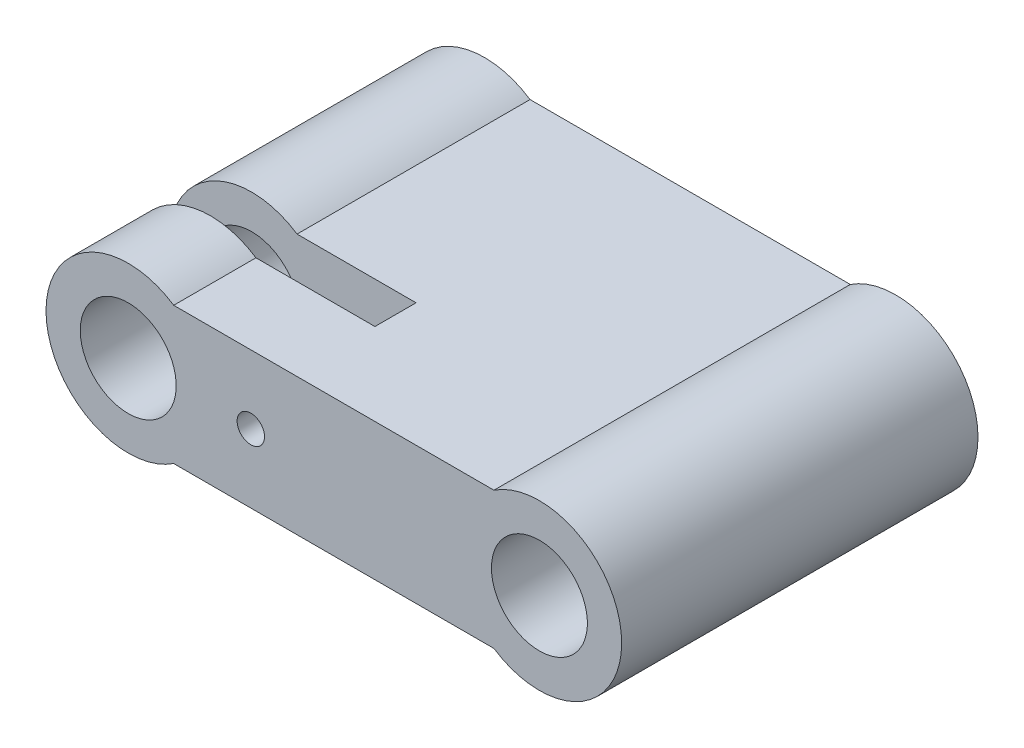
ISO-10303-21;
HEADER;
FILE_DESCRIPTION(('STEP AP214'),'2;1');
FILE_NAME('part.step','',(''),(''),'','','');
FILE_SCHEMA(('AUTOMOTIVE_DESIGN { 1 0 10303 214 1 1 1 1 }'));
ENDSEC;
DATA;
#1=APPLICATION_CONTEXT('core data for automotive mechanical design processes');
#2=APPLICATION_PROTOCOL_DEFINITION('international standard','automotive_design',2000,#1);
#3=PRODUCT_CONTEXT('',#1,'mechanical');
#4=PRODUCT('Part','Part','',(#3));
#5=PRODUCT_RELATED_PRODUCT_CATEGORY('part','',(#4));
#6=PRODUCT_DEFINITION_FORMATION('','',#4);
#7=PRODUCT_DEFINITION_CONTEXT('part definition',#1,'design');
#8=PRODUCT_DEFINITION('design','',#6,#7);
#9=PRODUCT_DEFINITION_SHAPE('','',#8);
#10=(LENGTH_UNIT() NAMED_UNIT(*) SI_UNIT(.MILLI.,.METRE.));
#11=(NAMED_UNIT(*) PLANE_ANGLE_UNIT() SI_UNIT($,.RADIAN.));
#12=(NAMED_UNIT(*) SI_UNIT($,.STERADIAN.) SOLID_ANGLE_UNIT());
#13=UNCERTAINTY_MEASURE_WITH_UNIT(LENGTH_MEASURE(1.E-05),#10,'distance_accuracy_value','');
#14=(GEOMETRIC_REPRESENTATION_CONTEXT(3) GLOBAL_UNCERTAINTY_ASSIGNED_CONTEXT((#13)) GLOBAL_UNIT_ASSIGNED_CONTEXT((#10,
#11,#12)) REPRESENTATION_CONTEXT('',''));
#15=CARTESIAN_POINT('',(0.,0.,0.));
#16=DIRECTION('',(0.,0.,1.));
#17=DIRECTION('',(1.,0.,0.));
#18=AXIS2_PLACEMENT_3D('',#15,#16,#17);
#19=CARTESIAN_POINT('',(0.,-37.,141.361318671366));
#20=DIRECTION('',(0.,1.,0.));
#21=DIRECTION('',(0.,0.,1.));
#22=AXIS2_PLACEMENT_3D('',#19,#20,#21);
#23=PLANE('',#22);
#24=DIRECTION('',(-1.,0.,0.));
#25=VECTOR('',#24,1.);
#26=CARTESIAN_POINT('',(0.,-37.,41.));
#27=LINE('',#26,#25);
#28=CARTESIAN_POINT('',(-47.5,-37.,41.));
#29=VERTEX_POINT('',#28);
#30=CARTESIAN_POINT('',(-64.8667504192892,-37.,41.));
#31=VERTEX_POINT('',#30);
#32=EDGE_CURVE('E150',#29,#31,#27,.T.);
#33=ORIENTED_EDGE('',*,*,#32,.F.);
#34=DIRECTION('',(0.,0.,1.));
#35=VECTOR('',#34,1.);
#36=CARTESIAN_POINT('',(-47.5,-37.,-38.5391052434009));
#37=LINE('',#36,#35);
#38=CARTESIAN_POINT('',(-47.5,-37.,35.));
#39=VERTEX_POINT('',#38);
#40=EDGE_CURVE('E128',#39,#29,#37,.T.);
#41=ORIENTED_EDGE('',*,*,#40,.F.);
#42=DIRECTION('',(-1.,0.,0.));
#43=VECTOR('',#42,1.);
#44=CARTESIAN_POINT('',(0.,-37.,35.));
#45=LINE('',#44,#43);
#46=CARTESIAN_POINT('',(-64.8667504192892,-37.,35.));
#47=VERTEX_POINT('',#46);
#48=EDGE_CURVE('E181',#39,#47,#45,.T.);
#49=ORIENTED_EDGE('',*,*,#48,.T.);
#50=DIRECTION('',(0.,0.,-1.));
#51=VECTOR('',#50,1.);
#52=CARTESIAN_POINT('',(-64.8667504192892,-37.,141.361318671366));
#53=LINE('',#52,#51);
#54=CARTESIAN_POINT('',(-64.8667504192892,-37.,1.));
#55=VERTEX_POINT('',#54);
#56=EDGE_CURVE('E107',#47,#55,#53,.T.);
#57=ORIENTED_EDGE('',*,*,#56,.T.);
#58=DIRECTION('',(1.,0.,0.));
#59=VECTOR('',#58,1.);
#60=CARTESIAN_POINT('',(0.,-37.,1.));
#61=LINE('',#60,#59);
#62=CARTESIAN_POINT('',(-18.1332495807108,-37.,1.));
#63=VERTEX_POINT('',#62);
#64=EDGE_CURVE('E99',#55,#63,#61,.T.);
#65=ORIENTED_EDGE('',*,*,#64,.T.);
#66=DIRECTION('',(0.,0.,-1.));
#67=VECTOR('',#66,1.);
#68=CARTESIAN_POINT('',(-18.1332495807108,-37.,141.361318671366));
#69=LINE('',#68,#67);
#70=CARTESIAN_POINT('',(-18.1332495807108,-37.,52.9999999999999));
#71=VERTEX_POINT('',#70);
#72=EDGE_CURVE('E84',#71,#63,#69,.T.);
#73=ORIENTED_EDGE('',*,*,#72,.F.);
#74=DIRECTION('',(-1.,0.,0.));
#75=VECTOR('',#74,1.);
#76=CARTESIAN_POINT('',(0.,-37.,52.9999999999999));
#77=LINE('',#76,#75);
#78=CARTESIAN_POINT('',(-64.8667504192892,-37.,52.9999999999999));
#79=VERTEX_POINT('',#78);
#80=EDGE_CURVE('E61',#71,#79,#77,.T.);
#81=ORIENTED_EDGE('',*,*,#80,.T.);
#82=EDGE_CURVE('E109',#79,#31,#53,.T.);
#83=ORIENTED_EDGE('',*,*,#82,.T.);
#84=EDGE_LOOP('',(#33,#41,#49,#57,#65,#73,#81,#83));
#85=FACE_BOUND('',#84,.T.);
#86=ADVANCED_FACE('F36',(#85),#23,.F.);
#87=CARTESIAN_POINT('',(0.,-17.,141.361318671366));
#88=DIRECTION('',(0.,1.,0.));
#89=DIRECTION('',(0.,0.,1.));
#90=AXIS2_PLACEMENT_3D('',#87,#88,#89);
#91=PLANE('',#90);
#92=DIRECTION('',(0.,0.,1.));
#93=VECTOR('',#92,1.);
#94=CARTESIAN_POINT('',(-47.5,-17.,-38.5391052434009));
#95=LINE('',#94,#93);
#96=CARTESIAN_POINT('',(-47.5,-17.,35.));
#97=VERTEX_POINT('',#96);
#98=CARTESIAN_POINT('',(-47.5,-17.,41.));
#99=VERTEX_POINT('',#98);
#100=EDGE_CURVE('E12',#97,#99,#95,.T.);
#101=ORIENTED_EDGE('',*,*,#100,.T.);
#102=DIRECTION('',(-1.,0.,0.));
#103=VECTOR('',#102,1.);
#104=CARTESIAN_POINT('',(0.,-17.,41.));
#105=LINE('',#104,#103);
#106=CARTESIAN_POINT('',(-64.8667504192892,-17.,41.));
#107=VERTEX_POINT('',#106);
#108=EDGE_CURVE('E147',#99,#107,#105,.T.);
#109=ORIENTED_EDGE('',*,*,#108,.T.);
#110=DIRECTION('',(0.,0.,-1.));
#111=VECTOR('',#110,1.);
#112=CARTESIAN_POINT('',(-64.8667504192892,-17.,141.361318671366));
#113=LINE('',#112,#111);
#114=CARTESIAN_POINT('',(-64.8667504192892,-17.,52.9999999999999));
#115=VERTEX_POINT('',#114);
#116=EDGE_CURVE('E118',#115,#107,#113,.T.);
#117=ORIENTED_EDGE('',*,*,#116,.F.);
#118=DIRECTION('',(-1.,0.,0.));
#119=VECTOR('',#118,1.);
#120=CARTESIAN_POINT('',(0.,-17.,52.9999999999999));
#121=LINE('',#120,#119);
#122=CARTESIAN_POINT('',(-18.1332495807108,-17.,52.9999999999999));
#123=VERTEX_POINT('',#122);
#124=EDGE_CURVE('E130',#123,#115,#121,.T.);
#125=ORIENTED_EDGE('',*,*,#124,.F.);
#126=DIRECTION('',(0.,0.,-1.));
#127=VECTOR('',#126,1.);
#128=CARTESIAN_POINT('',(-18.1332495807108,-17.,141.361318671366));
#129=LINE('',#128,#127);
#130=CARTESIAN_POINT('',(-18.1332495807108,-17.,1.));
#131=VERTEX_POINT('',#130);
#132=EDGE_CURVE('E102',#123,#131,#129,.T.);
#133=ORIENTED_EDGE('',*,*,#132,.T.);
#134=DIRECTION('',(1.,0.,0.));
#135=VECTOR('',#134,1.);
#136=CARTESIAN_POINT('',(0.,-17.,1.));
#137=LINE('',#136,#135);
#138=CARTESIAN_POINT('',(-64.8667504192892,-17.,1.));
#139=VERTEX_POINT('',#138);
#140=EDGE_CURVE('E101',#139,#131,#137,.T.);
#141=ORIENTED_EDGE('',*,*,#140,.F.);
#142=CARTESIAN_POINT('',(-64.8667504192892,-17.,35.));
#143=VERTEX_POINT('',#142);
#144=EDGE_CURVE('E121',#143,#139,#113,.T.);
#145=ORIENTED_EDGE('',*,*,#144,.F.);
#146=DIRECTION('',(-1.,0.,0.));
#147=VECTOR('',#146,1.);
#148=CARTESIAN_POINT('',(0.,-17.,35.));
#149=LINE('',#148,#147);
#150=EDGE_CURVE('E52',#97,#143,#149,.T.);
#151=ORIENTED_EDGE('',*,*,#150,.F.);
#152=EDGE_LOOP('',(#101,#109,#117,#125,#133,#141,#145,#151));
#153=FACE_BOUND('',#152,.T.);
#154=ADVANCED_FACE('F156',(#153),#91,.T.);
#155=CARTESIAN_POINT('',(-71.5,-27.,141.361318671366));
#156=DIRECTION('',(0.,0.,-1.));
#157=DIRECTION('',(-1.,0.,0.));
#158=AXIS2_PLACEMENT_3D('',#155,#156,#157);
#159=CYLINDRICAL_SURFACE('',#158,7.);
#160=CARTESIAN_POINT('',(-71.5,-27.,52.9999999999999));
#161=DIRECTION('',(0.,0.,-1.));
#162=DIRECTION('',(-1.,0.,0.));
#163=AXIS2_PLACEMENT_3D('',#160,#161,#162);
#164=CIRCLE('',#163,7.);
#165=CARTESIAN_POINT('',(-78.5,-27.,52.9999999999999));
#166=VERTEX_POINT('',#165);
#167=EDGE_CURVE('E123',#166,#166,#164,.T.);
#168=ORIENTED_EDGE('',*,*,#167,.F.);
#169=EDGE_LOOP('',(#168));
#170=FACE_BOUND('',#169,.T.);
#171=CARTESIAN_POINT('',(-71.5,-27.,41.));
#172=DIRECTION('',(0.,0.,-1.));
#173=DIRECTION('',(-1.,0.,0.));
#174=AXIS2_PLACEMENT_3D('',#171,#172,#173);
#175=CIRCLE('',#174,7.);
#176=CARTESIAN_POINT('',(-78.5,-27.,41.));
#177=VERTEX_POINT('',#176);
#178=EDGE_CURVE('E191',#177,#177,#175,.T.);
#179=ORIENTED_EDGE('',*,*,#178,.T.);
#180=EDGE_LOOP('',(#179));
#181=FACE_BOUND('',#180,.T.);
#182=ADVANCED_FACE('F238',(#170,#181),#159,.F.);
#183=CARTESIAN_POINT('',(-71.5,-27.,141.361318671366));
#184=DIRECTION('',(0.,0.,-1.));
#185=DIRECTION('',(-1.,0.,0.));
#186=AXIS2_PLACEMENT_3D('',#183,#184,#185);
#187=CYLINDRICAL_SURFACE('',#186,12.);
#188=CARTESIAN_POINT('',(-71.5,-27.,41.));
#189=DIRECTION('',(0.,0.,-1.));
#190=DIRECTION('',(-1.,0.,0.));
#191=AXIS2_PLACEMENT_3D('',#188,#189,#190);
#192=CIRCLE('',#191,12.);
#193=EDGE_CURVE('E45',#31,#107,#192,.T.);
#194=ORIENTED_EDGE('',*,*,#193,.F.);
#195=ORIENTED_EDGE('',*,*,#82,.F.);
#196=CARTESIAN_POINT('',(-71.5,-27.,52.9999999999999));
#197=DIRECTION('',(0.,0.,-1.));
#198=DIRECTION('',(-1.,0.,0.));
#199=AXIS2_PLACEMENT_3D('',#196,#197,#198);
#200=CIRCLE('',#199,12.);
#201=EDGE_CURVE('E117',#79,#115,#200,.T.);
#202=ORIENTED_EDGE('',*,*,#201,.T.);
#203=ORIENTED_EDGE('',*,*,#116,.T.);
#204=EDGE_LOOP('',(#194,#195,#202,#203));
#205=FACE_BOUND('',#204,.T.);
#206=ADVANCED_FACE('F161',(#205),#187,.T.);
#207=CARTESIAN_POINT('',(-11.5,-27.,141.361318671366));
#208=DIRECTION('',(0.,0.,-1.));
#209=DIRECTION('',(-1.,0.,0.));
#210=AXIS2_PLACEMENT_3D('',#207,#208,#209);
#211=CYLINDRICAL_SURFACE('',#210,12.);
#212=ORIENTED_EDGE('',*,*,#132,.F.);
#213=CARTESIAN_POINT('',(-11.5,-27.,52.9999999999999));
#214=DIRECTION('',(0.,0.,-1.));
#215=DIRECTION('',(-1.,0.,0.));
#216=AXIS2_PLACEMENT_3D('',#213,#214,#215);
#217=CIRCLE('',#216,12.);
#218=EDGE_CURVE('E90',#123,#71,#217,.T.);
#219=ORIENTED_EDGE('',*,*,#218,.T.);
#220=ORIENTED_EDGE('',*,*,#72,.T.);
#221=CARTESIAN_POINT('',(-11.5,-27.,1.));
#222=DIRECTION('',(0.,0.,1.));
#223=DIRECTION('',(1.,0.,0.));
#224=AXIS2_PLACEMENT_3D('',#221,#222,#223);
#225=CIRCLE('',#224,12.);
#226=EDGE_CURVE('E88',#63,#131,#225,.T.);
#227=ORIENTED_EDGE('',*,*,#226,.T.);
#228=EDGE_LOOP('',(#212,#219,#220,#227));
#229=FACE_BOUND('',#228,.T.);
#230=ADVANCED_FACE('F87',(#229),#211,.T.);
#231=CARTESIAN_POINT('',(-71.5,-27.,35.));
#232=DIRECTION('',(0.,0.,-1.));
#233=DIRECTION('',(-1.,0.,0.));
#234=AXIS2_PLACEMENT_3D('',#231,#232,#233);
#235=CIRCLE('',#234,7.);
#236=CARTESIAN_POINT('',(-78.5,-27.,35.));
#237=VERTEX_POINT('',#236);
#238=EDGE_CURVE('E159',#237,#237,#235,.T.);
#239=ORIENTED_EDGE('',*,*,#238,.F.);
#240=EDGE_LOOP('',(#239));
#241=FACE_BOUND('',#240,.T.);
#242=CARTESIAN_POINT('',(-71.5,-27.,1.));
#243=DIRECTION('',(0.,0.,1.));
#244=DIRECTION('',(1.,0.,0.));
#245=AXIS2_PLACEMENT_3D('',#242,#243,#244);
#246=CIRCLE('',#245,7.);
#247=CARTESIAN_POINT('',(-64.4999999999999,-27.,1.));
#248=VERTEX_POINT('',#247);
#249=EDGE_CURVE('E197',#248,#248,#246,.T.);
#250=ORIENTED_EDGE('',*,*,#249,.F.);
#251=EDGE_LOOP('',(#250));
#252=FACE_BOUND('',#251,.T.);
#253=ADVANCED_FACE('F242',(#241,#252),#159,.F.);
#254=ORIENTED_EDGE('',*,*,#56,.F.);
#255=CARTESIAN_POINT('',(-71.5,-27.,35.));
#256=DIRECTION('',(0.,0.,-1.));
#257=DIRECTION('',(-1.,0.,0.));
#258=AXIS2_PLACEMENT_3D('',#255,#256,#257);
#259=CIRCLE('',#258,12.);
#260=EDGE_CURVE('E132',#47,#143,#259,.T.);
#261=ORIENTED_EDGE('',*,*,#260,.T.);
#262=ORIENTED_EDGE('',*,*,#144,.T.);
#263=CARTESIAN_POINT('',(-71.5,-27.,1.));
#264=DIRECTION('',(0.,0.,1.));
#265=DIRECTION('',(1.,0.,0.));
#266=AXIS2_PLACEMENT_3D('',#263,#264,#265);
#267=CIRCLE('',#266,12.);
#268=EDGE_CURVE('E120',#139,#55,#267,.T.);
#269=ORIENTED_EDGE('',*,*,#268,.T.);
#270=EDGE_LOOP('',(#254,#261,#262,#269));
#271=FACE_BOUND('',#270,.T.);
#272=ADVANCED_FACE('F201',(#271),#187,.T.);
#273=CARTESIAN_POINT('',(-11.5,-27.,141.361318671366));
#274=DIRECTION('',(0.,0.,-1.));
#275=DIRECTION('',(-1.,0.,0.));
#276=AXIS2_PLACEMENT_3D('',#273,#274,#275);
#277=CYLINDRICAL_SURFACE('',#276,7.);
#278=CARTESIAN_POINT('',(-11.5,-27.,52.9999999999999));
#279=DIRECTION('',(0.,0.,-1.));
#280=DIRECTION('',(-1.,0.,0.));
#281=AXIS2_PLACEMENT_3D('',#278,#279,#280);
#282=CIRCLE('',#281,7.);
#283=CARTESIAN_POINT('',(-18.5,-27.,52.9999999999999));
#284=VERTEX_POINT('',#283);
#285=EDGE_CURVE('E126',#284,#284,#282,.T.);
#286=ORIENTED_EDGE('',*,*,#285,.F.);
#287=EDGE_LOOP('',(#286));
#288=FACE_BOUND('',#287,.T.);
#289=CARTESIAN_POINT('',(-11.5,-27.,1.));
#290=DIRECTION('',(0.,0.,1.));
#291=DIRECTION('',(1.,0.,0.));
#292=AXIS2_PLACEMENT_3D('',#289,#290,#291);
#293=CIRCLE('',#292,7.);
#294=CARTESIAN_POINT('',(-4.49999999999996,-27.,1.));
#295=VERTEX_POINT('',#294);
#296=EDGE_CURVE('E127',#295,#295,#293,.T.);
#297=ORIENTED_EDGE('',*,*,#296,.F.);
#298=EDGE_LOOP('',(#297));
#299=FACE_BOUND('',#298,.T.);
#300=ADVANCED_FACE('F221',(#288,#299),#277,.F.);
#301=CARTESIAN_POINT('',(0.,0.,1.));
#302=DIRECTION('',(0.,0.,1.));
#303=DIRECTION('',(1.,0.,0.));
#304=AXIS2_PLACEMENT_3D('',#301,#302,#303);
#305=PLANE('',#304);
#306=CARTESIAN_POINT('',(-53.6114561800004,-27.,1.));
#307=DIRECTION('',(0.,0.,1.));
#308=DIRECTION('',(1.,0.,0.));
#309=AXIS2_PLACEMENT_3D('',#306,#307,#308);
#310=CIRCLE('',#309,1.99999999999907);
#311=CARTESIAN_POINT('',(-51.6114561800014,-27.,1.));
#312=VERTEX_POINT('',#311);
#313=EDGE_CURVE('E206',#312,#312,#310,.T.);
#314=ORIENTED_EDGE('',*,*,#313,.T.);
#315=EDGE_LOOP('',(#314));
#316=FACE_BOUND('',#315,.T.);
#317=ORIENTED_EDGE('',*,*,#64,.F.);
#318=ORIENTED_EDGE('',*,*,#268,.F.);
#319=ORIENTED_EDGE('',*,*,#140,.T.);
#320=ORIENTED_EDGE('',*,*,#226,.F.);
#321=EDGE_LOOP('',(#317,#318,#319,#320));
#322=FACE_BOUND('',#321,.T.);
#323=ORIENTED_EDGE('',*,*,#249,.T.);
#324=EDGE_LOOP('',(#323));
#325=FACE_BOUND('',#324,.T.);
#326=ORIENTED_EDGE('',*,*,#296,.T.);
#327=EDGE_LOOP('',(#326));
#328=FACE_BOUND('',#327,.T.);
#329=ADVANCED_FACE('F96',(#316,#322,#325,#328),#305,.F.);
#330=CARTESIAN_POINT('',(3.77590331487527,-42.1587723817396,52.9999999999999));
#331=DIRECTION('',(0.,0.,-1.));
#332=DIRECTION('',(-0.9848077530135,-0.173648177659606,0.));
#333=AXIS2_PLACEMENT_3D('',#330,#331,#332);
#334=PLANE('',#333);
#335=CARTESIAN_POINT('',(-53.6114561800004,-27.,52.9999999999999));
#336=DIRECTION('',(0.,0.,1.));
#337=DIRECTION('',(1.,0.,0.));
#338=AXIS2_PLACEMENT_3D('',#335,#336,#337);
#339=CIRCLE('',#338,1.99999999999907);
#340=CARTESIAN_POINT('',(-51.6114561800014,-27.,52.9999999999999));
#341=VERTEX_POINT('',#340);
#342=EDGE_CURVE('E209',#341,#341,#339,.T.);
#343=ORIENTED_EDGE('',*,*,#342,.F.);
#344=EDGE_LOOP('',(#343));
#345=FACE_BOUND('',#344,.T.);
#346=ORIENTED_EDGE('',*,*,#167,.T.);
#347=EDGE_LOOP('',(#346));
#348=FACE_BOUND('',#347,.T.);
#349=ORIENTED_EDGE('',*,*,#285,.T.);
#350=EDGE_LOOP('',(#349));
#351=FACE_BOUND('',#350,.T.);
#352=ORIENTED_EDGE('',*,*,#218,.F.);
#353=ORIENTED_EDGE('',*,*,#124,.T.);
#354=ORIENTED_EDGE('',*,*,#201,.F.);
#355=ORIENTED_EDGE('',*,*,#80,.F.);
#356=EDGE_LOOP('',(#352,#353,#354,#355));
#357=FACE_BOUND('',#356,.T.);
#358=ADVANCED_FACE('F38',(#345,#348,#351,#357),#334,.F.);
#359=CARTESIAN_POINT('',(-71.5,-27.,-38.5391052434009));
#360=DIRECTION('',(0.,0.,1.));
#361=DIRECTION('',(1.,0.,0.));
#362=AXIS2_PLACEMENT_3D('',#359,#360,#361);
#363=CYLINDRICAL_SURFACE('',#362,26.);
#364=ORIENTED_EDGE('',*,*,#40,.T.);
#365=CARTESIAN_POINT('',(-71.5,-27.,41.));
#366=DIRECTION('',(0.,0.,-1.));
#367=DIRECTION('',(-1.,0.,0.));
#368=AXIS2_PLACEMENT_3D('',#365,#366,#367);
#369=CIRCLE('',#368,26.);
#370=EDGE_CURVE('E179',#99,#29,#369,.T.);
#371=ORIENTED_EDGE('',*,*,#370,.F.);
#372=ORIENTED_EDGE('',*,*,#100,.F.);
#373=CARTESIAN_POINT('',(-71.5,-27.,35.));
#374=DIRECTION('',(0.,0.,-1.));
#375=DIRECTION('',(-1.,0.,0.));
#376=AXIS2_PLACEMENT_3D('',#373,#374,#375);
#377=CIRCLE('',#376,26.);
#378=EDGE_CURVE('E178',#97,#39,#377,.T.);
#379=ORIENTED_EDGE('',*,*,#378,.T.);
#380=EDGE_LOOP('',(#364,#371,#372,#379));
#381=FACE_BOUND('',#380,.T.);
#382=ADVANCED_FACE('F177',(#381),#363,.F.);
#383=CARTESIAN_POINT('',(-71.5,-27.,41.));
#384=DIRECTION('',(0.,0.,-1.));
#385=DIRECTION('',(-1.,0.,0.));
#386=AXIS2_PLACEMENT_3D('',#383,#384,#385);
#387=PLANE('',#386);
#388=CARTESIAN_POINT('',(-53.6114561800004,-27.,41.));
#389=DIRECTION('',(0.,0.,-1.));
#390=DIRECTION('',(-1.,0.,0.));
#391=AXIS2_PLACEMENT_3D('',#388,#389,#390);
#392=CIRCLE('',#391,1.99999999999907);
#393=CARTESIAN_POINT('',(-55.6114561799995,-27.,41.));
#394=VERTEX_POINT('',#393);
#395=EDGE_CURVE('E202',#394,#394,#392,.T.);
#396=ORIENTED_EDGE('',*,*,#395,.F.);
#397=EDGE_LOOP('',(#396));
#398=FACE_BOUND('',#397,.T.);
#399=ORIENTED_EDGE('',*,*,#178,.F.);
#400=EDGE_LOOP('',(#399));
#401=FACE_BOUND('',#400,.T.);
#402=ORIENTED_EDGE('',*,*,#32,.T.);
#403=ORIENTED_EDGE('',*,*,#193,.T.);
#404=ORIENTED_EDGE('',*,*,#108,.F.);
#405=ORIENTED_EDGE('',*,*,#370,.T.);
#406=EDGE_LOOP('',(#402,#403,#404,#405));
#407=FACE_BOUND('',#406,.T.);
#408=ADVANCED_FACE('F144',(#398,#401,#407),#387,.T.);
#409=CARTESIAN_POINT('',(-71.5,-27.,35.));
#410=DIRECTION('',(0.,0.,-1.));
#411=DIRECTION('',(-1.,0.,0.));
#412=AXIS2_PLACEMENT_3D('',#409,#410,#411);
#413=PLANE('',#412);
#414=CARTESIAN_POINT('',(-53.6114561800004,-27.,35.));
#415=DIRECTION('',(0.,0.,-1.));
#416=DIRECTION('',(-1.,0.,0.));
#417=AXIS2_PLACEMENT_3D('',#414,#415,#416);
#418=CIRCLE('',#417,1.99999999999907);
#419=CARTESIAN_POINT('',(-55.6114561799995,-27.,35.));
#420=VERTEX_POINT('',#419);
#421=EDGE_CURVE('E40',#420,#420,#418,.T.);
#422=ORIENTED_EDGE('',*,*,#421,.T.);
#423=EDGE_LOOP('',(#422));
#424=FACE_BOUND('',#423,.T.);
#425=ORIENTED_EDGE('',*,*,#238,.T.);
#426=EDGE_LOOP('',(#425));
#427=FACE_BOUND('',#426,.T.);
#428=ORIENTED_EDGE('',*,*,#378,.F.);
#429=ORIENTED_EDGE('',*,*,#150,.T.);
#430=ORIENTED_EDGE('',*,*,#260,.F.);
#431=ORIENTED_EDGE('',*,*,#48,.F.);
#432=EDGE_LOOP('',(#428,#429,#430,#431));
#433=FACE_BOUND('',#432,.T.);
#434=ADVANCED_FACE('F180',(#424,#427,#433),#413,.F.);
#435=CARTESIAN_POINT('',(-53.6114561800004,-27.,1.));
#436=DIRECTION('',(0.,0.,1.));
#437=DIRECTION('',(1.,0.,0.));
#438=AXIS2_PLACEMENT_3D('',#435,#436,#437);
#439=CYLINDRICAL_SURFACE('',#438,1.99999999999907);
#440=ORIENTED_EDGE('',*,*,#313,.F.);
#441=EDGE_LOOP('',(#440));
#442=FACE_BOUND('',#441,.T.);
#443=ORIENTED_EDGE('',*,*,#421,.F.);
#444=EDGE_LOOP('',(#443));
#445=FACE_BOUND('',#444,.T.);
#446=ADVANCED_FACE('F266',(#442,#445),#439,.F.);
#447=ORIENTED_EDGE('',*,*,#395,.T.);
#448=EDGE_LOOP('',(#447));
#449=FACE_BOUND('',#448,.T.);
#450=ORIENTED_EDGE('',*,*,#342,.T.);
#451=EDGE_LOOP('',(#450));
#452=FACE_BOUND('',#451,.T.);
#453=ADVANCED_FACE('F213',(#449,#452),#439,.F.);
#454=CLOSED_SHELL('',(#86,#154,#182,#206,#230,#253,#272,#300,#329,#358,#382,#408,#434,#446,#453));
#455=MANIFOLD_SOLID_BREP('B2',#454);
#456=ADVANCED_BREP_SHAPE_REPRESENTATION('',(#18,#455),#14);
#457=SHAPE_DEFINITION_REPRESENTATION(#9,#456);
ENDSEC;
END-ISO-10303-21;
